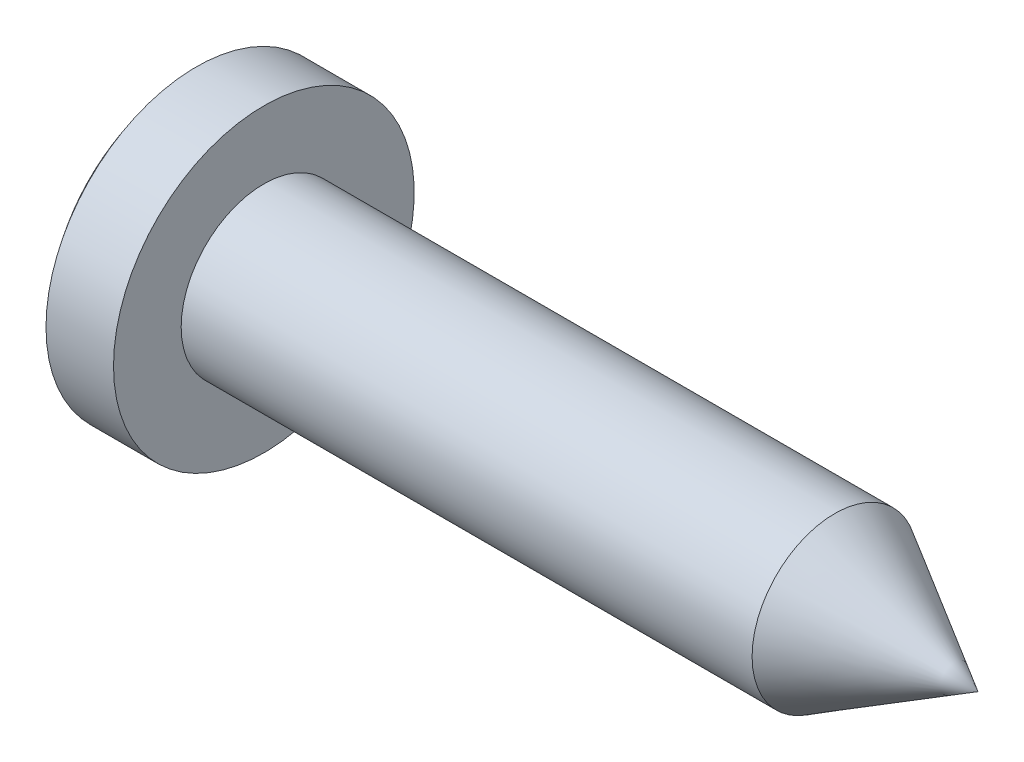
ISO-10303-21;
HEADER;
FILE_DESCRIPTION(('STEP AP214'),'2;1');
FILE_NAME('part.step','',(''),(''),'','','');
FILE_SCHEMA(('AUTOMOTIVE_DESIGN { 1 0 10303 214 1 1 1 1 }'));
ENDSEC;
DATA;
#1=APPLICATION_CONTEXT('core data for automotive mechanical design processes');
#2=APPLICATION_PROTOCOL_DEFINITION('international standard','automotive_design',2000,#1);
#3=PRODUCT_CONTEXT('',#1,'mechanical');
#4=PRODUCT('Part','Part','',(#3));
#5=PRODUCT_RELATED_PRODUCT_CATEGORY('part','',(#4));
#6=PRODUCT_DEFINITION_FORMATION('','',#4);
#7=PRODUCT_DEFINITION_CONTEXT('part definition',#1,'design');
#8=PRODUCT_DEFINITION('design','',#6,#7);
#9=PRODUCT_DEFINITION_SHAPE('','',#8);
#10=(LENGTH_UNIT() NAMED_UNIT(*) SI_UNIT(.MILLI.,.METRE.));
#11=(NAMED_UNIT(*) PLANE_ANGLE_UNIT() SI_UNIT($,.RADIAN.));
#12=(NAMED_UNIT(*) SI_UNIT($,.STERADIAN.) SOLID_ANGLE_UNIT());
#13=UNCERTAINTY_MEASURE_WITH_UNIT(LENGTH_MEASURE(1.E-05),#10,'distance_accuracy_value','');
#14=(GEOMETRIC_REPRESENTATION_CONTEXT(3) GLOBAL_UNCERTAINTY_ASSIGNED_CONTEXT((#13)) GLOBAL_UNIT_ASSIGNED_CONTEXT((#10,
#11,#12)) REPRESENTATION_CONTEXT('',''));
#15=CARTESIAN_POINT('',(0.,0.,0.));
#16=DIRECTION('',(0.,0.,1.));
#17=DIRECTION('',(1.,0.,0.));
#18=AXIS2_PLACEMENT_3D('',#15,#16,#17);
#19=CARTESIAN_POINT('',(1.6,0.,0.));
#20=DIRECTION('',(-1.,0.,0.));
#21=DIRECTION('',(0.,1.,0.));
#22=AXIS2_PLACEMENT_3D('',#19,#20,#21);
#23=SPHERICAL_SURFACE('',#22,3.2);
#24=CARTESIAN_POINT('',(-0.89799919935936,0.,0.));
#25=DIRECTION('',(-1.,0.,0.));
#26=DIRECTION('',(0.,0.,1.));
#27=AXIS2_PLACEMENT_3D('',#24,#25,#26);
#28=CIRCLE('',#27,2.);
#29=CARTESIAN_POINT('',(-0.89799919935936,0.,2.));
#30=VERTEX_POINT('',#29);
#31=EDGE_CURVE('E287',#30,#30,#28,.T.);
#32=ORIENTED_EDGE('',*,*,#31,.T.);
#33=EDGE_LOOP('',(#32));
#34=FACE_BOUND('',#33,.T.);
#35=CARTESIAN_POINT('',(1.56503616117409,0.0806815870157537,0.322726348063015));
#36=DIRECTION('',(0.104528463267654,-0.241206989505462,-0.964827958021851));
#37=DIRECTION('',(0.,0.970142500145332,-0.242535625036333));
#38=AXIS2_PLACEMENT_3D('',#35,#36,#37);
#39=CIRCLE('',#38,3.18247006517848);
#40=CARTESIAN_POINT('',(-1.45274996309991,0.934523397478773,-0.217677932639515));
#41=VERTEX_POINT('',#40);
#42=CARTESIAN_POINT('',(-1.54602165644221,0.569150220513997,-0.136439597205102));
#43=VERTEX_POINT('',#42);
#44=EDGE_CURVE('E11',#41,#43,#39,.F.);
#45=ORIENTED_EDGE('',*,*,#44,.F.);
#46=CARTESIAN_POINT('',(1.66379421431252,0.606961405040141,0.));
#47=DIRECTION('',(0.104528463267654,0.994521895368273,0.));
#48=DIRECTION('',(-0.994521895368273,0.104528463267654,0.));
#49=AXIS2_PLACEMENT_3D('',#46,#47,#48);
#50=CIRCLE('',#49,3.14126219074625);
#51=CARTESIAN_POINT('',(-1.45274996309991,0.934523397478773,0.217677932639514));
#52=VERTEX_POINT('',#51);
#53=EDGE_CURVE('E42',#52,#41,#50,.F.);
#54=ORIENTED_EDGE('',*,*,#53,.F.);
#55=CARTESIAN_POINT('',(1.56503616117409,0.0806815870157537,-0.322726348063015));
#56=DIRECTION('',(0.104528463267654,-0.241206989505462,0.964827958021851));
#57=DIRECTION('',(0.,-0.970142500145332,-0.242535625036333));
#58=AXIS2_PLACEMENT_3D('',#55,#56,#57);
#59=CIRCLE('',#58,3.18247006517848);
#60=CARTESIAN_POINT('',(-1.54602165644221,0.569150220513997,0.136439597205102));
#61=VERTEX_POINT('',#60);
#62=EDGE_CURVE('E327',#61,#52,#59,.F.);
#63=ORIENTED_EDGE('',*,*,#62,.F.);
#64=CARTESIAN_POINT('',(1.60749262454255,0.0356437803082173,0.0617368384676569));
#65=DIRECTION('',(0.104528463267654,0.497260947684128,0.861281226008779));
#66=DIRECTION('',(0.,-0.866025403784443,0.499999999999992));
#67=AXIS2_PLACEMENT_3D('',#64,#65,#66);
#68=CIRCLE('',#67,3.19919707806175);
#69=CARTESIAN_POINT('',(-1.57234339721419,0.296847915734236,0.296847915734238));
#70=VERTEX_POINT('',#69);
#71=EDGE_CURVE('E325',#70,#61,#68,.F.);
#72=ORIENTED_EDGE('',*,*,#71,.F.);
#73=CARTESIAN_POINT('',(1.60749262454255,0.0617368384676551,0.0356437803082149));
#74=DIRECTION('',(0.104528463267654,0.861281226008788,0.497260947684114));
#75=DIRECTION('',(0.,-0.499999999999977,0.866025403784452));
#76=AXIS2_PLACEMENT_3D('',#73,#74,#75);
#77=CIRCLE('',#76,3.19919707806175);
#78=CARTESIAN_POINT('',(-1.54602165644221,0.136439597205108,0.569150220513995));
#79=VERTEX_POINT('',#78);
#80=EDGE_CURVE('E323',#79,#70,#77,.F.);
#81=ORIENTED_EDGE('',*,*,#80,.F.);
#82=CARTESIAN_POINT('',(1.56503616117409,-0.322726348063014,0.0806815870157571));
#83=DIRECTION('',(0.104528463267654,0.964827958021848,-0.241206989505473));
#84=DIRECTION('',(0.,0.242535625036343,0.970142500145329));
#85=AXIS2_PLACEMENT_3D('',#82,#83,#84);
#86=CIRCLE('',#85,3.18247006517848);
#87=CARTESIAN_POINT('',(-1.45274996309991,0.217677932639524,0.934523397478771));
#88=VERTEX_POINT('',#87);
#89=EDGE_CURVE('E321',#88,#79,#86,.F.);
#90=ORIENTED_EDGE('',*,*,#89,.F.);
#91=CARTESIAN_POINT('',(1.66379421431252,0.,0.606961405040141));
#92=DIRECTION('',(0.104528463267654,0.,0.994521895368273));
#93=DIRECTION('',(0.994521895368273,0.,-0.104528463267654));
#94=AXIS2_PLACEMENT_3D('',#91,#92,#93);
#95=CIRCLE('',#94,3.14126219074625);
#96=CARTESIAN_POINT('',(-1.45274996309991,-0.217677932639505,0.934523397478775));
#97=VERTEX_POINT('',#96);
#98=EDGE_CURVE('E319',#97,#88,#95,.F.);
#99=ORIENTED_EDGE('',*,*,#98,.F.);
#100=CARTESIAN_POINT('',(1.56503616117409,0.322726348063016,0.0806815870157503));
#101=DIRECTION('',(0.104528463267654,-0.964827958021853,-0.241206989505452));
#102=DIRECTION('',(0.,0.242535625036323,-0.970142500145334));
#103=AXIS2_PLACEMENT_3D('',#100,#101,#102);
#104=CIRCLE('',#103,3.18247006517848);
#105=CARTESIAN_POINT('',(-1.54602165644221,-0.136439597205096,0.569150220513998));
#106=VERTEX_POINT('',#105);
#107=EDGE_CURVE('E317',#106,#97,#104,.F.);
#108=ORIENTED_EDGE('',*,*,#107,.F.);
#109=CARTESIAN_POINT('',(1.60749262454255,-0.0617368384676559,0.0356437803082175));
#110=DIRECTION('',(0.104528463267654,-0.861281226008775,0.497260947684136));
#111=DIRECTION('',(0.,-0.499999999999999,-0.866025403784439));
#112=AXIS2_PLACEMENT_3D('',#109,#110,#111);
#113=CIRCLE('',#112,3.19919707806175);
#114=CARTESIAN_POINT('',(-1.57234339721419,-0.296847915734233,0.296847915734241));
#115=VERTEX_POINT('',#114);
#116=EDGE_CURVE('E315',#115,#106,#113,.F.);
#117=ORIENTED_EDGE('',*,*,#116,.F.);
#118=CARTESIAN_POINT('',(1.60749262454255,-0.035643780308217,0.0617368384676573));
#119=DIRECTION('',(0.104528463267654,-0.497260947684123,0.861281226008782));
#120=DIRECTION('',(0.,-0.866025403784447,-0.499999999999986));
#121=AXIS2_PLACEMENT_3D('',#118,#119,#120);
#122=CIRCLE('',#121,3.19919707806175);
#123=CARTESIAN_POINT('',(-1.54602165644221,-0.569150220513996,0.136439597205106));
#124=VERTEX_POINT('',#123);
#125=EDGE_CURVE('E313',#124,#115,#122,.F.);
#126=ORIENTED_EDGE('',*,*,#125,.F.);
#127=CARTESIAN_POINT('',(1.56503616117409,-0.0806815870157559,-0.322726348063015));
#128=DIRECTION('',(0.104528463267654,0.241206989505469,0.964827958021849));
#129=DIRECTION('',(0.,-0.97014250014533,0.242535625036339));
#130=AXIS2_PLACEMENT_3D('',#127,#128,#129);
#131=CIRCLE('',#130,3.18247006517848);
#132=CARTESIAN_POINT('',(-1.45274996309991,-0.934523397478772,0.217677932639521));
#133=VERTEX_POINT('',#132);
#134=EDGE_CURVE('E311',#133,#124,#131,.F.);
#135=ORIENTED_EDGE('',*,*,#134,.F.);
#136=CARTESIAN_POINT('',(1.66379421431252,-0.606961405040141,0.));
#137=DIRECTION('',(0.104528463267654,-0.994521895368273,0.));
#138=DIRECTION('',(0.994521895368273,0.104528463267654,0.));
#139=AXIS2_PLACEMENT_3D('',#136,#137,#138);
#140=CIRCLE('',#139,3.14126219074625);
#141=CARTESIAN_POINT('',(-1.45274996309991,-0.934523397478775,-0.217677932639508));
#142=VERTEX_POINT('',#141);
#143=EDGE_CURVE('E309',#142,#133,#140,.F.);
#144=ORIENTED_EDGE('',*,*,#143,.F.);
#145=CARTESIAN_POINT('',(1.56503616117409,-0.0806815870157514,0.322726348063016));
#146=DIRECTION('',(0.104528463267654,0.241206989505456,-0.964827958021853));
#147=DIRECTION('',(0.,0.970142500145334,0.242535625036326));
#148=AXIS2_PLACEMENT_3D('',#145,#146,#147);
#149=CIRCLE('',#148,3.18247006517848);
#150=CARTESIAN_POINT('',(-1.54602165644221,-0.569150220513998,-0.136439597205098));
#151=VERTEX_POINT('',#150);
#152=EDGE_CURVE('E307',#151,#142,#149,.F.);
#153=ORIENTED_EDGE('',*,*,#152,.F.);
#154=CARTESIAN_POINT('',(1.60749262454255,-0.035643780308221,-0.0617368384676605));
#155=DIRECTION('',(0.104528463267654,-0.497260947684145,-0.861281226008769));
#156=DIRECTION('',(0.,0.866025403784434,-0.500000000000008));
#157=AXIS2_PLACEMENT_3D('',#154,#155,#156);
#158=CIRCLE('',#157,3.19919707806175);
#159=CARTESIAN_POINT('',(-1.57234339721419,-0.296847915734241,-0.296847915734238));
#160=VERTEX_POINT('',#159);
#161=EDGE_CURVE('E305',#160,#151,#158,.F.);
#162=ORIENTED_EDGE('',*,*,#161,.F.);
#163=CARTESIAN_POINT('',(1.60749262454255,-0.0617368384676609,-0.0356437803082204));
#164=DIRECTION('',(0.104528463267654,-0.861281226008775,-0.497260947684136));
#165=DIRECTION('',(0.,0.499999999999999,-0.866025403784439));
#166=AXIS2_PLACEMENT_3D('',#163,#164,#165);
#167=CIRCLE('',#166,3.19919707806175);
#168=CARTESIAN_POINT('',(-1.54602165644221,-0.136439597205104,-0.569150220513996));
#169=VERTEX_POINT('',#168);
#170=EDGE_CURVE('E303',#169,#160,#167,.F.);
#171=ORIENTED_EDGE('',*,*,#170,.F.);
#172=CARTESIAN_POINT('',(1.56503616117409,0.322726348063015,-0.0806815870157548));
#173=DIRECTION('',(0.104528463267654,-0.96482795802185,0.241206989505466));
#174=DIRECTION('',(0.,-0.242535625036336,-0.970142500145331));
#175=AXIS2_PLACEMENT_3D('',#172,#173,#174);
#176=CIRCLE('',#175,3.18247006517848);
#177=CARTESIAN_POINT('',(-1.45274996309991,-0.217677932639518,-0.934523397478772));
#178=VERTEX_POINT('',#177);
#179=EDGE_CURVE('E301',#178,#169,#176,.F.);
#180=ORIENTED_EDGE('',*,*,#179,.F.);
#181=CARTESIAN_POINT('',(1.66379421431252,0.,-0.606961405040141));
#182=DIRECTION('',(0.104528463267654,0.,-0.994521895368273));
#183=DIRECTION('',(-0.994521895368273,0.,-0.104528463267654));
#184=AXIS2_PLACEMENT_3D('',#181,#182,#183);
#185=CIRCLE('',#184,3.14126219074625);
#186=CARTESIAN_POINT('',(-1.45274996309991,0.217677932639511,-0.934523397478774));
#187=VERTEX_POINT('',#186);
#188=EDGE_CURVE('E299',#187,#178,#185,.F.);
#189=ORIENTED_EDGE('',*,*,#188,.F.);
#190=CARTESIAN_POINT('',(1.56503616117409,-0.322726348063015,-0.0806815870157525));
#191=DIRECTION('',(0.104528463267654,0.964827958021852,0.241206989505459));
#192=DIRECTION('',(0.,-0.242535625036329,0.970142500145333));
#193=AXIS2_PLACEMENT_3D('',#190,#191,#192);
#194=CIRCLE('',#193,3.18247006517848);
#195=CARTESIAN_POINT('',(-1.54602165644221,0.1364395972051,-0.569150220513997));
#196=VERTEX_POINT('',#195);
#197=EDGE_CURVE('E297',#196,#187,#194,.F.);
#198=ORIENTED_EDGE('',*,*,#197,.F.);
#199=CARTESIAN_POINT('',(1.60749262454255,0.0617368384676561,-0.035643780308217));
#200=DIRECTION('',(0.104528463267654,0.861281226008778,-0.497260947684129));
#201=DIRECTION('',(0.,0.499999999999993,0.866025403784443));
#202=AXIS2_PLACEMENT_3D('',#199,#200,#201);
#203=CIRCLE('',#202,3.19919707806175);
#204=CARTESIAN_POINT('',(-1.57234339721419,0.296847915734236,-0.296847915734239));
#205=VERTEX_POINT('',#204);
#206=EDGE_CURVE('E295',#205,#196,#203,.F.);
#207=ORIENTED_EDGE('',*,*,#206,.F.);
#208=CARTESIAN_POINT('',(1.60749262454255,0.0356437803082174,-0.061736838467657));
#209=DIRECTION('',(0.104528463267654,0.497260947684129,-0.861281226008779));
#210=DIRECTION('',(0.,0.866025403784443,0.499999999999992));
#211=AXIS2_PLACEMENT_3D('',#208,#209,#210);
#212=CIRCLE('',#211,3.19919707806175);
#213=EDGE_CURVE('E293',#43,#205,#212,.F.);
#214=ORIENTED_EDGE('',*,*,#213,.F.);
#215=EDGE_LOOP('',(#45,#54,#63,#72,#81,#90,#99,#108,#117,#126,#135,#144,#153,#162,#171,#180,
#189,#198,#207,#214));
#216=FACE_BOUND('',#215,.T.);
#217=ADVANCED_FACE('F34',(#34,#216),#23,.T.);
#218=CARTESIAN_POINT('',(0.,0.,0.));
#219=DIRECTION('',(-1.,0.,0.));
#220=DIRECTION('',(0.,0.,1.));
#221=AXIS2_PLACEMENT_3D('',#218,#219,#220);
#222=CYLINDRICAL_SURFACE('',#221,1.1);
#223=CARTESIAN_POINT('',(0.,0.,0.));
#224=DIRECTION('',(-1.,0.,0.));
#225=DIRECTION('',(0.,0.,1.));
#226=AXIS2_PLACEMENT_3D('',#223,#224,#225);
#227=CIRCLE('',#226,1.1);
#228=CARTESIAN_POINT('',(0.,0.,1.1));
#229=VERTEX_POINT('',#228);
#230=EDGE_CURVE('E194',#229,#229,#227,.T.);
#231=ORIENTED_EDGE('',*,*,#230,.F.);
#232=EDGE_LOOP('',(#231));
#233=FACE_BOUND('',#232,.T.);
#234=CARTESIAN_POINT('',(7.59474411167421,0.,0.));
#235=DIRECTION('',(-1.,0.,0.));
#236=DIRECTION('',(0.,0.,1.));
#237=AXIS2_PLACEMENT_3D('',#234,#235,#236);
#238=CIRCLE('',#237,1.1);
#239=CARTESIAN_POINT('',(7.59474411167421,0.,1.1));
#240=VERTEX_POINT('',#239);
#241=EDGE_CURVE('E190',#240,#240,#238,.T.);
#242=ORIENTED_EDGE('',*,*,#241,.T.);
#243=EDGE_LOOP('',(#242));
#244=FACE_BOUND('',#243,.T.);
#245=ADVANCED_FACE('F423',(#233,#244),#222,.T.);
#246=CARTESIAN_POINT('',(0.,1.1,0.));
#247=DIRECTION('',(-1.,0.,0.));
#248=DIRECTION('',(0.,0.,1.));
#249=AXIS2_PLACEMENT_3D('',#246,#247,#248);
#250=PLANE('',#249);
#251=CARTESIAN_POINT('',(0.,0.,0.));
#252=DIRECTION('',(-1.,0.,0.));
#253=DIRECTION('',(0.,0.,1.));
#254=AXIS2_PLACEMENT_3D('',#251,#252,#253);
#255=CIRCLE('',#254,2.);
#256=CARTESIAN_POINT('',(0.,0.,2.));
#257=VERTEX_POINT('',#256);
#258=EDGE_CURVE('E290',#257,#257,#255,.T.);
#259=ORIENTED_EDGE('',*,*,#258,.F.);
#260=EDGE_LOOP('',(#259));
#261=FACE_BOUND('',#260,.T.);
#262=ORIENTED_EDGE('',*,*,#230,.T.);
#263=EDGE_LOOP('',(#262));
#264=FACE_BOUND('',#263,.T.);
#265=ADVANCED_FACE('F36',(#261,#264),#250,.F.);
#266=CARTESIAN_POINT('',(0.,0.,0.));
#267=DIRECTION('',(-1.,0.,0.));
#268=DIRECTION('',(0.,0.,1.));
#269=AXIS2_PLACEMENT_3D('',#266,#267,#268);
#270=CYLINDRICAL_SURFACE('',#269,2.);
#271=ORIENTED_EDGE('',*,*,#31,.F.);
#272=EDGE_LOOP('',(#271));
#273=FACE_BOUND('',#272,.T.);
#274=ORIENTED_EDGE('',*,*,#258,.T.);
#275=EDGE_LOOP('',(#274));
#276=FACE_BOUND('',#275,.T.);
#277=ADVANCED_FACE('F432',(#273,#276),#270,.T.);
#278=CARTESIAN_POINT('',(7.59474411167421,0.,0.));
#279=DIRECTION('',(-1.,0.,0.));
#280=DIRECTION('',(0.,0.,1.));
#281=AXIS2_PLACEMENT_3D('',#278,#279,#280);
#282=CONICAL_SURFACE('',#281,1.1,0.523598775598293);
#283=CARTESIAN_POINT('',(9.5,0.,0.));
#284=VERTEX_POINT('',#283);
#285=VERTEX_LOOP('',#284);
#286=FACE_BOUND('',#285,.T.);
#287=ORIENTED_EDGE('',*,*,#241,.F.);
#288=EDGE_LOOP('',(#287));
#289=FACE_BOUND('',#288,.T.);
#290=ADVANCED_FACE('F434',(#286,#289),#282,.T.);
#291=CARTESIAN_POINT('',(-1.6,0.95,-0.2375));
#292=DIRECTION('',(0.104528463267654,-0.241206989505462,-0.964827958021851));
#293=DIRECTION('',(0.,0.970142500145332,-0.242535625036333));
#294=AXIS2_PLACEMENT_3D('',#291,#292,#293);
#295=PLANE('',#294);
#296=ORIENTED_EDGE('',*,*,#44,.T.);
#297=DIRECTION('',(-0.993634572314887,0.0156427600493606,-0.111560032084303));
#298=VECTOR('',#297,1.);
#299=CARTESIAN_POINT('',(-1.6,0.57,-0.1425));
#300=LINE('',#299,#298);
#301=CARTESIAN_POINT('',(-0.75,0.556618474827239,-0.0470664976705276));
#302=VERTEX_POINT('',#301);
#303=EDGE_CURVE('E49',#302,#43,#300,.T.);
#304=ORIENTED_EDGE('',*,*,#303,.F.);
#305=DIRECTION('',(0.,-0.970142500145332,0.242535625036333));
#306=VECTOR('',#305,1.);
#307=CARTESIAN_POINT('',(-0.75,0.0216677931850071,0.0866711727400304));
#308=LINE('',#307,#306);
#309=CARTESIAN_POINT('',(-0.75,0.860661400024174,-0.123077228969761));
#310=VERTEX_POINT('',#309);
#311=EDGE_CURVE('E174',#302,#310,#308,.F.);
#312=ORIENTED_EDGE('',*,*,#311,.T.);
#313=DIRECTION('',(-0.985727427293419,0.103604127426078,-0.132693722013437));
#314=VECTOR('',#313,1.);
#315=CARTESIAN_POINT('',(-1.53787007542131,0.943469881790042,-0.229136378665655));
#316=LINE('',#315,#314);
#317=EDGE_CURVE('E185',#310,#41,#316,.T.);
#318=ORIENTED_EDGE('',*,*,#317,.T.);
#319=EDGE_LOOP('',(#296,#304,#312,#318));
#320=FACE_BOUND('',#319,.T.);
#321=ADVANCED_FACE('F184',(#320),#295,.F.);
#322=CARTESIAN_POINT('',(-1.6,0.95,0.2375));
#323=DIRECTION('',(0.104528463267654,0.994521895368273,0.));
#324=DIRECTION('',(-0.994521895368273,0.104528463267654,0.));
#325=AXIS2_PLACEMENT_3D('',#322,#323,#324);
#326=PLANE('',#325);
#327=ORIENTED_EDGE('',*,*,#53,.T.);
#328=ORIENTED_EDGE('',*,*,#317,.F.);
#329=DIRECTION('',(0.,0.,-1.));
#330=VECTOR('',#329,1.);
#331=CARTESIAN_POINT('',(-0.75,0.860661400024175,0.));
#332=LINE('',#331,#330);
#333=CARTESIAN_POINT('',(-0.75,0.860661400024174,0.123077228969761));
#334=VERTEX_POINT('',#333);
#335=EDGE_CURVE('E170',#310,#334,#332,.F.);
#336=ORIENTED_EDGE('',*,*,#335,.T.);
#337=DIRECTION('',(-0.985727427293419,0.103604127426078,0.132693722013437));
#338=VECTOR('',#337,1.);
#339=CARTESIAN_POINT('',(-1.6,0.95,0.2375));
#340=LINE('',#339,#338);
#341=EDGE_CURVE('E191',#334,#52,#340,.T.);
#342=ORIENTED_EDGE('',*,*,#341,.T.);
#343=EDGE_LOOP('',(#327,#328,#336,#342));
#344=FACE_BOUND('',#343,.T.);
#345=ADVANCED_FACE('F188',(#344),#326,.F.);
#346=CARTESIAN_POINT('',(-1.6,0.95,0.2375));
#347=DIRECTION('',(0.104528463267654,-0.241206989505462,0.964827958021851));
#348=DIRECTION('',(0.,-0.970142500145332,-0.242535625036333));
#349=AXIS2_PLACEMENT_3D('',#346,#347,#348);
#350=PLANE('',#349);
#351=ORIENTED_EDGE('',*,*,#62,.T.);
#352=ORIENTED_EDGE('',*,*,#341,.F.);
#353=DIRECTION('',(0.,0.970142500145332,0.242535625036333));
#354=VECTOR('',#353,1.);
#355=CARTESIAN_POINT('',(-0.75,0.0216677931850069,-0.0866711727400304));
#356=LINE('',#355,#354);
#357=CARTESIAN_POINT('',(-0.75,0.556618474827239,0.0470664976705276));
#358=VERTEX_POINT('',#357);
#359=EDGE_CURVE('E176',#334,#358,#356,.F.);
#360=ORIENTED_EDGE('',*,*,#359,.T.);
#361=DIRECTION('',(-0.993634572314886,0.0156427600493606,0.111560032084303));
#362=VECTOR('',#361,1.);
#363=CARTESIAN_POINT('',(-1.61643715208567,0.57025876960518,0.14434547646101));
#364=LINE('',#363,#362);
#365=EDGE_CURVE('E196',#358,#61,#364,.T.);
#366=ORIENTED_EDGE('',*,*,#365,.T.);
#367=EDGE_LOOP('',(#351,#352,#360,#366));
#368=FACE_BOUND('',#367,.T.);
#369=ADVANCED_FACE('F330',(#368),#350,.F.);
#370=CARTESIAN_POINT('',(-1.6,0.57,0.1425));
#371=DIRECTION('',(0.104528463267654,0.497260947684128,0.861281226008779));
#372=DIRECTION('',(0.,-0.866025403784443,0.499999999999992));
#373=AXIS2_PLACEMENT_3D('',#370,#371,#372);
#374=PLANE('',#373);
#375=ORIENTED_EDGE('',*,*,#71,.T.);
#376=ORIENTED_EDGE('',*,*,#365,.F.);
#377=DIRECTION('',(0.,0.866025403784443,-0.499999999999992));
#378=VECTOR('',#377,1.);
#379=CARTESIAN_POINT('',(-0.75,0.159535010031724,0.276322742960963));
#380=LINE('',#379,#378);
#381=CARTESIAN_POINT('',(-0.75,0.233575465858467,0.233575465858471));
#382=VERTEX_POINT('',#381);
#383=EDGE_CURVE('E252',#358,#382,#380,.F.);
#384=ORIENTED_EDGE('',*,*,#383,.T.);
#385=DIRECTION('',(-0.994132040497618,0.0764901498757915,0.0764901498757902));
#386=VECTOR('',#385,1.);
#387=CARTESIAN_POINT('',(-1.60871040111109,0.299646052667046,0.299646052667049));
#388=LINE('',#387,#386);
#389=EDGE_CURVE('E246',#382,#70,#388,.T.);
#390=ORIENTED_EDGE('',*,*,#389,.T.);
#391=EDGE_LOOP('',(#375,#376,#384,#390));
#392=FACE_BOUND('',#391,.T.);
#393=ADVANCED_FACE('F413',(#392),#374,.F.);
#394=CARTESIAN_POINT('',(-1.6,0.142500000000006,0.569999999999998));
#395=DIRECTION('',(0.104528463267654,0.861281226008788,0.497260947684114));
#396=DIRECTION('',(0.,-0.499999999999977,0.866025403784452));
#397=AXIS2_PLACEMENT_3D('',#394,#395,#396);
#398=PLANE('',#397);
#399=ORIENTED_EDGE('',*,*,#80,.T.);
#400=ORIENTED_EDGE('',*,*,#389,.F.);
#401=DIRECTION('',(0.,0.499999999999977,-0.866025403784452));
#402=VECTOR('',#401,1.);
#403=CARTESIAN_POINT('',(-0.75,0.276322742960963,0.159535010031718));
#404=LINE('',#403,#402);
#405=CARTESIAN_POINT('',(-0.75,0.0470664976705335,0.556618474827239));
#406=VERTEX_POINT('',#405);
#407=EDGE_CURVE('E254',#382,#406,#404,.F.);
#408=ORIENTED_EDGE('',*,*,#407,.T.);
#409=DIRECTION('',(-0.993634572314886,0.111560032084303,0.0156427600493589));
#410=VECTOR('',#409,1.);
#411=CARTESIAN_POINT('',(-1.6,0.142500000000006,0.569999999999998));
#412=LINE('',#411,#410);
#413=EDGE_CURVE('E243',#406,#79,#412,.T.);
#414=ORIENTED_EDGE('',*,*,#413,.T.);
#415=EDGE_LOOP('',(#399,#400,#408,#414));
#416=FACE_BOUND('',#415,.T.);
#417=ADVANCED_FACE('F410',(#416),#398,.F.);
#418=CARTESIAN_POINT('',(-1.6,0.23750000000001,0.949999999999997));
#419=DIRECTION('',(0.104528463267654,0.964827958021848,-0.241206989505473));
#420=DIRECTION('',(0.,0.242535625036343,0.970142500145329));
#421=AXIS2_PLACEMENT_3D('',#418,#419,#420);
#422=PLANE('',#421);
#423=ORIENTED_EDGE('',*,*,#89,.T.);
#424=ORIENTED_EDGE('',*,*,#413,.F.);
#425=DIRECTION('',(0.,-0.242535625036343,-0.970142500145329));
#426=VECTOR('',#425,1.);
#427=CARTESIAN_POINT('',(-0.75,-0.0866711727400301,0.0216677931850079));
#428=LINE('',#427,#426);
#429=CARTESIAN_POINT('',(-0.75,0.12307722896977,0.860661400024173));
#430=VERTEX_POINT('',#429);
#431=EDGE_CURVE('E256',#406,#430,#428,.F.);
#432=ORIENTED_EDGE('',*,*,#431,.T.);
#433=DIRECTION('',(-0.985727427293419,0.132693722013438,0.103604127426076));
#434=VECTOR('',#433,1.);
#435=CARTESIAN_POINT('',(-1.53787007542131,0.229136378665665,0.94346988179004));
#436=LINE('',#435,#434);
#437=EDGE_CURVE('E240',#430,#88,#436,.T.);
#438=ORIENTED_EDGE('',*,*,#437,.T.);
#439=EDGE_LOOP('',(#423,#424,#432,#438));
#440=FACE_BOUND('',#439,.T.);
#441=ADVANCED_FACE('F407',(#440),#422,.F.);
#442=CARTESIAN_POINT('',(-1.6,-0.23749999999999,0.950000000000002));
#443=DIRECTION('',(0.104528463267654,0.,0.994521895368273));
#444=DIRECTION('',(0.994521895368273,0.,-0.104528463267654));
#445=AXIS2_PLACEMENT_3D('',#442,#443,#444);
#446=PLANE('',#445);
#447=ORIENTED_EDGE('',*,*,#98,.T.);
#448=ORIENTED_EDGE('',*,*,#437,.F.);
#449=DIRECTION('',(0.,1.,0.));
#450=VECTOR('',#449,1.);
#451=CARTESIAN_POINT('',(-0.75,0.,0.860661400024174));
#452=LINE('',#451,#450);
#453=CARTESIAN_POINT('',(-0.75,-0.123077228969752,0.860661400024176));
#454=VERTEX_POINT('',#453);
#455=EDGE_CURVE('E258',#430,#454,#452,.F.);
#456=ORIENTED_EDGE('',*,*,#455,.T.);
#457=DIRECTION('',(-0.985727427293419,-0.132693722013436,0.103604127426079));
#458=VECTOR('',#457,1.);
#459=CARTESIAN_POINT('',(-1.6,-0.23749999999999,0.950000000000002));
#460=LINE('',#459,#458);
#461=EDGE_CURVE('E237',#454,#97,#460,.T.);
#462=ORIENTED_EDGE('',*,*,#461,.T.);
#463=EDGE_LOOP('',(#447,#448,#456,#462));
#464=FACE_BOUND('',#463,.T.);
#465=ADVANCED_FACE('F400',(#464),#446,.F.);
#466=CARTESIAN_POINT('',(-1.6,-0.23749999999999,0.950000000000002));
#467=DIRECTION('',(0.104528463267654,-0.964827958021853,-0.241206989505452));
#468=DIRECTION('',(0.,0.242535625036323,-0.970142500145334));
#469=AXIS2_PLACEMENT_3D('',#466,#467,#468);
#470=PLANE('',#469);
#471=ORIENTED_EDGE('',*,*,#107,.T.);
#472=ORIENTED_EDGE('',*,*,#461,.F.);
#473=DIRECTION('',(0.,-0.242535625036323,0.970142500145334));
#474=VECTOR('',#473,1.);
#475=CARTESIAN_POINT('',(-0.75,0.0866711727400305,0.0216677931850063));
#476=LINE('',#475,#474);
#477=CARTESIAN_POINT('',(-0.75,-0.0470664976705218,0.55661847482724));
#478=VERTEX_POINT('',#477);
#479=EDGE_CURVE('E260',#454,#478,#476,.F.);
#480=ORIENTED_EDGE('',*,*,#479,.T.);
#481=DIRECTION('',(-0.993634572314887,-0.111560032084303,0.0156427600493616));
#482=VECTOR('',#481,1.);
#483=CARTESIAN_POINT('',(-1.61643715208567,-0.144345476461004,0.570258769605181));
#484=LINE('',#483,#482);
#485=EDGE_CURVE('E234',#478,#106,#484,.T.);
#486=ORIENTED_EDGE('',*,*,#485,.T.);
#487=EDGE_LOOP('',(#471,#472,#480,#486));
#488=FACE_BOUND('',#487,.T.);
#489=ADVANCED_FACE('F398',(#488),#470,.F.);
#490=CARTESIAN_POINT('',(-1.6,-0.142499999999994,0.570000000000001));
#491=DIRECTION('',(0.104528463267654,-0.861281226008775,0.497260947684136));
#492=DIRECTION('',(0.,-0.499999999999999,-0.866025403784439));
#493=AXIS2_PLACEMENT_3D('',#490,#491,#492);
#494=PLANE('',#493);
#495=ORIENTED_EDGE('',*,*,#116,.T.);
#496=ORIENTED_EDGE('',*,*,#485,.F.);
#497=DIRECTION('',(0.,0.499999999999999,0.866025403784439));
#498=VECTOR('',#497,1.);
#499=CARTESIAN_POINT('',(-0.75,-0.276322742960961,0.159535010031725));
#500=LINE('',#499,#498);
#501=CARTESIAN_POINT('',(-0.75,-0.233575465858466,0.233575465858472));
#502=VERTEX_POINT('',#501);
#503=EDGE_CURVE('E262',#478,#502,#500,.F.);
#504=ORIENTED_EDGE('',*,*,#503,.T.);
#505=DIRECTION('',(-0.994132040497618,-0.07649014987579,0.0764901498757912));
#506=VECTOR('',#505,1.);
#507=CARTESIAN_POINT('',(-1.60871040111109,-0.299646052667044,0.299646052667052));
#508=LINE('',#507,#506);
#509=EDGE_CURVE('E231',#502,#115,#508,.T.);
#510=ORIENTED_EDGE('',*,*,#509,.T.);
#511=EDGE_LOOP('',(#495,#496,#504,#510));
#512=FACE_BOUND('',#511,.T.);
#513=ADVANCED_FACE('F391',(#512),#494,.F.);
#514=CARTESIAN_POINT('',(-1.6,-0.569999999999999,0.142500000000004));
#515=DIRECTION('',(0.104528463267654,-0.497260947684123,0.861281226008782));
#516=DIRECTION('',(0.,-0.866025403784447,-0.499999999999986));
#517=AXIS2_PLACEMENT_3D('',#514,#515,#516);
#518=PLANE('',#517);
#519=ORIENTED_EDGE('',*,*,#125,.T.);
#520=ORIENTED_EDGE('',*,*,#509,.F.);
#521=DIRECTION('',(0.,0.866025403784447,0.499999999999986));
#522=VECTOR('',#521,1.);
#523=CARTESIAN_POINT('',(-0.75,-0.159535010031723,0.276322742960963));
#524=LINE('',#523,#522);
#525=CARTESIAN_POINT('',(-0.75,-0.556618474827239,0.0470664976705315));
#526=VERTEX_POINT('',#525);
#527=EDGE_CURVE('E264',#502,#526,#524,.F.);
#528=ORIENTED_EDGE('',*,*,#527,.T.);
#529=DIRECTION('',(-0.993634572314887,-0.0156427600493598,0.111560032084303));
#530=VECTOR('',#529,1.);
#531=CARTESIAN_POINT('',(-1.6,-0.569999999999999,0.142500000000004));
#532=LINE('',#531,#530);
#533=EDGE_CURVE('E228',#526,#124,#532,.T.);
#534=ORIENTED_EDGE('',*,*,#533,.T.);
#535=EDGE_LOOP('',(#519,#520,#528,#534));
#536=FACE_BOUND('',#535,.T.);
#537=ADVANCED_FACE('F388',(#536),#518,.F.);
#538=CARTESIAN_POINT('',(-1.6,-0.949999999999998,0.237500000000007));
#539=DIRECTION('',(0.104528463267654,0.241206989505469,0.964827958021849));
#540=DIRECTION('',(0.,-0.97014250014533,0.242535625036339));
#541=AXIS2_PLACEMENT_3D('',#538,#539,#540);
#542=PLANE('',#541);
#543=ORIENTED_EDGE('',*,*,#134,.T.);
#544=ORIENTED_EDGE('',*,*,#533,.F.);
#545=DIRECTION('',(0.,0.97014250014533,-0.242535625036339));
#546=VECTOR('',#545,1.);
#547=CARTESIAN_POINT('',(-0.75,-0.0216677931850086,-0.0866711727400299));
#548=LINE('',#547,#546);
#549=CARTESIAN_POINT('',(-0.75,-0.860661400024174,0.123077228969767));
#550=VERTEX_POINT('',#549);
#551=EDGE_CURVE('E266',#526,#550,#548,.F.);
#552=ORIENTED_EDGE('',*,*,#551,.T.);
#553=DIRECTION('',(-0.985727427293419,-0.103604127426077,0.132693722013438));
#554=VECTOR('',#553,1.);
#555=CARTESIAN_POINT('',(-1.53787007542131,-0.943469881790041,0.229136378665662));
#556=LINE('',#555,#554);
#557=EDGE_CURVE('E225',#550,#133,#556,.T.);
#558=ORIENTED_EDGE('',*,*,#557,.T.);
#559=EDGE_LOOP('',(#543,#544,#552,#558));
#560=FACE_BOUND('',#559,.T.);
#561=ADVANCED_FACE('F380',(#560),#542,.F.);
#562=CARTESIAN_POINT('',(-1.6,-0.950000000000001,-0.237499999999994));
#563=DIRECTION('',(0.104528463267654,-0.994521895368273,0.));
#564=DIRECTION('',(0.994521895368273,0.104528463267654,0.));
#565=AXIS2_PLACEMENT_3D('',#562,#563,#564);
#566=PLANE('',#565);
#567=ORIENTED_EDGE('',*,*,#143,.T.);
#568=ORIENTED_EDGE('',*,*,#557,.F.);
#569=DIRECTION('',(0.,0.,1.));
#570=VECTOR('',#569,1.);
#571=CARTESIAN_POINT('',(-0.75,-0.860661400024175,0.));
#572=LINE('',#571,#570);
#573=CARTESIAN_POINT('',(-0.75,-0.860661400024175,-0.123077228969755));
#574=VERTEX_POINT('',#573);
#575=EDGE_CURVE('E268',#550,#574,#572,.F.);
#576=ORIENTED_EDGE('',*,*,#575,.T.);
#577=DIRECTION('',(-0.985727427293419,-0.103604127426079,-0.132693722013436));
#578=VECTOR('',#577,1.);
#579=CARTESIAN_POINT('',(-1.6,-0.950000000000001,-0.237499999999994));
#580=LINE('',#579,#578);
#581=EDGE_CURVE('E222',#574,#142,#580,.T.);
#582=ORIENTED_EDGE('',*,*,#581,.T.);
#583=EDGE_LOOP('',(#567,#568,#576,#582));
#584=FACE_BOUND('',#583,.T.);
#585=ADVANCED_FACE('F378',(#584),#566,.F.);
#586=CARTESIAN_POINT('',(-1.6,-0.950000000000001,-0.237499999999994));
#587=DIRECTION('',(0.104528463267654,0.241206989505456,-0.964827958021853));
#588=DIRECTION('',(0.,0.970142500145334,0.242535625036326));
#589=AXIS2_PLACEMENT_3D('',#586,#587,#588);
#590=PLANE('',#589);
#591=ORIENTED_EDGE('',*,*,#152,.T.);
#592=ORIENTED_EDGE('',*,*,#581,.F.);
#593=DIRECTION('',(0.,-0.970142500145334,-0.242535625036326));
#594=VECTOR('',#593,1.);
#595=CARTESIAN_POINT('',(-0.75,-0.0216677931850076,0.0866711727400303));
#596=LINE('',#595,#594);
#597=CARTESIAN_POINT('',(-0.75,-0.556618474827239,-0.0470664976705236));
#598=VERTEX_POINT('',#597);
#599=EDGE_CURVE('E270',#574,#598,#596,.F.);
#600=ORIENTED_EDGE('',*,*,#599,.T.);
#601=DIRECTION('',(-0.993634572314886,-0.015642760049362,-0.111560032084303));
#602=VECTOR('',#601,1.);
#603=CARTESIAN_POINT('',(-1.61643715208567,-0.570258769605181,-0.144345476461006));
#604=LINE('',#603,#602);
#605=EDGE_CURVE('E219',#598,#151,#604,.T.);
#606=ORIENTED_EDGE('',*,*,#605,.T.);
#607=EDGE_LOOP('',(#591,#592,#600,#606));
#608=FACE_BOUND('',#607,.T.);
#609=ADVANCED_FACE('F371',(#608),#590,.F.);
#610=CARTESIAN_POINT('',(-1.6,-0.570000000000001,-0.142499999999996));
#611=DIRECTION('',(0.104528463267654,-0.497260947684145,-0.861281226008769));
#612=DIRECTION('',(0.,0.866025403784434,-0.500000000000008));
#613=AXIS2_PLACEMENT_3D('',#610,#611,#612);
#614=PLANE('',#613);
#615=ORIENTED_EDGE('',*,*,#161,.T.);
#616=ORIENTED_EDGE('',*,*,#605,.F.);
#617=DIRECTION('',(0.,-0.866025403784434,0.500000000000008));
#618=VECTOR('',#617,1.);
#619=CARTESIAN_POINT('',(-0.75,-0.159535010031732,-0.276322742960964));
#620=LINE('',#619,#618);
#621=CARTESIAN_POINT('',(-0.75,-0.233575465858473,-0.233575465858471));
#622=VERTEX_POINT('',#621);
#623=EDGE_CURVE('E272',#598,#622,#620,.F.);
#624=ORIENTED_EDGE('',*,*,#623,.T.);
#625=DIRECTION('',(-0.994132040497618,-0.0764901498757908,-0.07649014987579));
#626=VECTOR('',#625,1.);
#627=CARTESIAN_POINT('',(-1.60871040111109,-0.299646052667052,-0.299646052667049));
#628=LINE('',#627,#626);
#629=EDGE_CURVE('E216',#622,#160,#628,.T.);
#630=ORIENTED_EDGE('',*,*,#629,.T.);
#631=EDGE_LOOP('',(#615,#616,#624,#630));
#632=FACE_BOUND('',#631,.T.);
#633=ADVANCED_FACE('F368',(#632),#614,.F.);
#634=CARTESIAN_POINT('',(-1.6,-0.142500000000002,-0.569999999999999));
#635=DIRECTION('',(0.104528463267654,-0.861281226008775,-0.497260947684136));
#636=DIRECTION('',(0.,0.499999999999999,-0.866025403784439));
#637=AXIS2_PLACEMENT_3D('',#634,#635,#636);
#638=PLANE('',#637);
#639=ORIENTED_EDGE('',*,*,#170,.T.);
#640=ORIENTED_EDGE('',*,*,#629,.F.);
#641=DIRECTION('',(0.,-0.499999999999999,0.866025403784439));
#642=VECTOR('',#641,1.);
#643=CARTESIAN_POINT('',(-0.75,-0.276322742960966,-0.159535010031729));
#644=LINE('',#643,#642);
#645=CARTESIAN_POINT('',(-0.75,-0.0470664976705294,-0.556618474827239));
#646=VERTEX_POINT('',#645);
#647=EDGE_CURVE('E274',#622,#646,#644,.F.);
#648=ORIENTED_EDGE('',*,*,#647,.T.);
#649=DIRECTION('',(-0.993634572314886,-0.111560032084303,-0.0156427600493608));
#650=VECTOR('',#649,1.);
#651=CARTESIAN_POINT('',(-1.6,-0.142500000000002,-0.569999999999999));
#652=LINE('',#651,#650);
#653=EDGE_CURVE('E213',#646,#169,#652,.T.);
#654=ORIENTED_EDGE('',*,*,#653,.T.);
#655=EDGE_LOOP('',(#639,#640,#648,#654));
#656=FACE_BOUND('',#655,.T.);
#657=ADVANCED_FACE('F360',(#656),#638,.F.);
#658=CARTESIAN_POINT('',(-1.6,-0.237500000000003,-0.949999999999999));
#659=DIRECTION('',(0.104528463267654,-0.96482795802185,0.241206989505466));
#660=DIRECTION('',(0.,-0.242535625036336,-0.970142500145331));
#661=AXIS2_PLACEMENT_3D('',#658,#659,#660);
#662=PLANE('',#661);
#663=ORIENTED_EDGE('',*,*,#179,.T.);
#664=ORIENTED_EDGE('',*,*,#653,.F.);
#665=DIRECTION('',(0.,0.242535625036336,0.970142500145331));
#666=VECTOR('',#665,1.);
#667=CARTESIAN_POINT('',(-0.75,0.08667117274003,-0.0216677931850084));
#668=LINE('',#667,#666);
#669=CARTESIAN_POINT('',(-0.75,-0.123077228969764,-0.860661400024174));
#670=VERTEX_POINT('',#669);
#671=EDGE_CURVE('E276',#646,#670,#668,.F.);
#672=ORIENTED_EDGE('',*,*,#671,.T.);
#673=DIRECTION('',(-0.985727427293419,-0.132693722013437,-0.103604127426077));
#674=VECTOR('',#673,1.);
#675=CARTESIAN_POINT('',(-1.53787007542131,-0.229136378665658,-0.943469881790042));
#676=LINE('',#675,#674);
#677=EDGE_CURVE('E210',#670,#178,#676,.T.);
#678=ORIENTED_EDGE('',*,*,#677,.T.);
#679=EDGE_LOOP('',(#663,#664,#672,#678));
#680=FACE_BOUND('',#679,.T.);
#681=ADVANCED_FACE('F358',(#680),#662,.F.);
#682=CARTESIAN_POINT('',(-1.6,0.237499999999997,-0.950000000000001));
#683=DIRECTION('',(0.104528463267654,0.,-0.994521895368273));
#684=DIRECTION('',(-0.994521895368273,0.,-0.104528463267654));
#685=AXIS2_PLACEMENT_3D('',#682,#683,#684);
#686=PLANE('',#685);
#687=ORIENTED_EDGE('',*,*,#188,.T.);
#688=ORIENTED_EDGE('',*,*,#677,.F.);
#689=DIRECTION('',(0.,-1.,0.));
#690=VECTOR('',#689,1.);
#691=CARTESIAN_POINT('',(-0.75,0.,-0.860661400024174));
#692=LINE('',#691,#690);
#693=CARTESIAN_POINT('',(-0.75,0.123077228969758,-0.860661400024175));
#694=VERTEX_POINT('',#693);
#695=EDGE_CURVE('E278',#670,#694,#692,.F.);
#696=ORIENTED_EDGE('',*,*,#695,.T.);
#697=DIRECTION('',(-0.985727427293418,0.132693722013436,-0.103604127426078));
#698=VECTOR('',#697,1.);
#699=CARTESIAN_POINT('',(-1.6,0.237499999999997,-0.950000000000001));
#700=LINE('',#699,#698);
#701=EDGE_CURVE('E207',#694,#187,#700,.T.);
#702=ORIENTED_EDGE('',*,*,#701,.T.);
#703=EDGE_LOOP('',(#687,#688,#696,#702));
#704=FACE_BOUND('',#703,.T.);
#705=ADVANCED_FACE('F351',(#704),#686,.F.);
#706=CARTESIAN_POINT('',(-1.6,0.237499999999997,-0.950000000000001));
#707=DIRECTION('',(0.104528463267654,0.964827958021852,0.241206989505459));
#708=DIRECTION('',(0.,-0.242535625036329,0.970142500145333));
#709=AXIS2_PLACEMENT_3D('',#706,#707,#708);
#710=PLANE('',#709);
#711=ORIENTED_EDGE('',*,*,#197,.T.);
#712=ORIENTED_EDGE('',*,*,#701,.F.);
#713=DIRECTION('',(0.,0.242535625036329,-0.970142500145333));
#714=VECTOR('',#713,1.);
#715=CARTESIAN_POINT('',(-0.75,-0.0866711727400303,-0.0216677931850075));
#716=LINE('',#715,#714);
#717=CARTESIAN_POINT('',(-0.75,0.0470664976705257,-0.55661847482724));
#718=VERTEX_POINT('',#717);
#719=EDGE_CURVE('E280',#694,#718,#716,.F.);
#720=ORIENTED_EDGE('',*,*,#719,.T.);
#721=DIRECTION('',(-0.993634572314887,0.111560032084303,-0.0156427600493608));
#722=VECTOR('',#721,1.);
#723=CARTESIAN_POINT('',(-1.61643715208567,0.144345476461008,-0.57025876960518));
#724=LINE('',#723,#722);
#725=EDGE_CURVE('E204',#718,#196,#724,.T.);
#726=ORIENTED_EDGE('',*,*,#725,.T.);
#727=EDGE_LOOP('',(#711,#712,#720,#726));
#728=FACE_BOUND('',#727,.T.);
#729=ADVANCED_FACE('F348',(#728),#710,.F.);
#730=CARTESIAN_POINT('',(-1.6,0.142499999999998,-0.57));
#731=DIRECTION('',(0.104528463267654,0.861281226008778,-0.497260947684129));
#732=DIRECTION('',(0.,0.499999999999993,0.866025403784443));
#733=AXIS2_PLACEMENT_3D('',#730,#731,#732);
#734=PLANE('',#733);
#735=ORIENTED_EDGE('',*,*,#206,.T.);
#736=ORIENTED_EDGE('',*,*,#725,.F.);
#737=DIRECTION('',(0.,-0.499999999999993,-0.866025403784443));
#738=VECTOR('',#737,1.);
#739=CARTESIAN_POINT('',(-0.75,0.276322742960961,-0.159535010031725));
#740=LINE('',#739,#738);
#741=CARTESIAN_POINT('',(-0.75,0.233575465858468,-0.233575465858471));
#742=VERTEX_POINT('',#741);
#743=EDGE_CURVE('E282',#718,#742,#740,.F.);
#744=ORIENTED_EDGE('',*,*,#743,.T.);
#745=DIRECTION('',(-0.994132040497618,0.0764901498757906,-0.0764901498757907));
#746=VECTOR('',#745,1.);
#747=CARTESIAN_POINT('',(-1.60871040111109,0.299646052667046,-0.299646052667049));
#748=LINE('',#747,#746);
#749=EDGE_CURVE('E200',#742,#205,#748,.T.);
#750=ORIENTED_EDGE('',*,*,#749,.T.);
#751=EDGE_LOOP('',(#735,#736,#744,#750));
#752=FACE_BOUND('',#751,.T.);
#753=ADVANCED_FACE('F340',(#752),#734,.F.);
#754=CARTESIAN_POINT('',(-1.6,0.57,-0.1425));
#755=DIRECTION('',(0.104528463267654,0.497260947684129,-0.861281226008779));
#756=DIRECTION('',(0.,0.866025403784443,0.499999999999992));
#757=AXIS2_PLACEMENT_3D('',#754,#755,#756);
#758=PLANE('',#757);
#759=ORIENTED_EDGE('',*,*,#213,.T.);
#760=ORIENTED_EDGE('',*,*,#749,.F.);
#761=DIRECTION('',(0.,-0.866025403784443,-0.499999999999992));
#762=VECTOR('',#761,1.);
#763=CARTESIAN_POINT('',(-0.75,0.159535010031724,-0.276322742960963));
#764=LINE('',#763,#762);
#765=EDGE_CURVE('E201',#742,#302,#764,.F.);
#766=ORIENTED_EDGE('',*,*,#765,.T.);
#767=ORIENTED_EDGE('',*,*,#303,.T.);
#768=EDGE_LOOP('',(#759,#760,#766,#767));
#769=FACE_BOUND('',#768,.T.);
#770=ADVANCED_FACE('F338',(#769),#758,.F.);
#771=CARTESIAN_POINT('',(-0.75,0.,0.));
#772=DIRECTION('',(-1.,0.,0.));
#773=DIRECTION('',(0.,0.,1.));
#774=AXIS2_PLACEMENT_3D('',#771,#772,#773);
#775=PLANE('',#774);
#776=ORIENTED_EDGE('',*,*,#311,.F.);
#777=ORIENTED_EDGE('',*,*,#765,.F.);
#778=ORIENTED_EDGE('',*,*,#743,.F.);
#779=ORIENTED_EDGE('',*,*,#719,.F.);
#780=ORIENTED_EDGE('',*,*,#695,.F.);
#781=ORIENTED_EDGE('',*,*,#671,.F.);
#782=ORIENTED_EDGE('',*,*,#647,.F.);
#783=ORIENTED_EDGE('',*,*,#623,.F.);
#784=ORIENTED_EDGE('',*,*,#599,.F.);
#785=ORIENTED_EDGE('',*,*,#575,.F.);
#786=ORIENTED_EDGE('',*,*,#551,.F.);
#787=ORIENTED_EDGE('',*,*,#527,.F.);
#788=ORIENTED_EDGE('',*,*,#503,.F.);
#789=ORIENTED_EDGE('',*,*,#479,.F.);
#790=ORIENTED_EDGE('',*,*,#455,.F.);
#791=ORIENTED_EDGE('',*,*,#431,.F.);
#792=ORIENTED_EDGE('',*,*,#407,.F.);
#793=ORIENTED_EDGE('',*,*,#383,.F.);
#794=ORIENTED_EDGE('',*,*,#359,.F.);
#795=ORIENTED_EDGE('',*,*,#335,.F.);
#796=EDGE_LOOP('',(#776,#777,#778,#779,#780,#781,#782,#783,#784,#785,#786,#787,#788,#789,#790,
#791,#792,#793,#794,#795));
#797=FACE_BOUND('',#796,.T.);
#798=ADVANCED_FACE('F172',(#797),#775,.T.);
#799=CLOSED_SHELL('',(#217,#245,#265,#277,#290,#321,#345,#369,#393,#417,#441,#465,#489,#513,
#537,#561,#585,#609,#633,#657,#681,#705,#729,#753,#770,#798));
#800=MANIFOLD_SOLID_BREP('B2',#799);
#801=ADVANCED_BREP_SHAPE_REPRESENTATION('',(#18,#800),#14);
#802=SHAPE_DEFINITION_REPRESENTATION(#9,#801);
ENDSEC;
END-ISO-10303-21;
